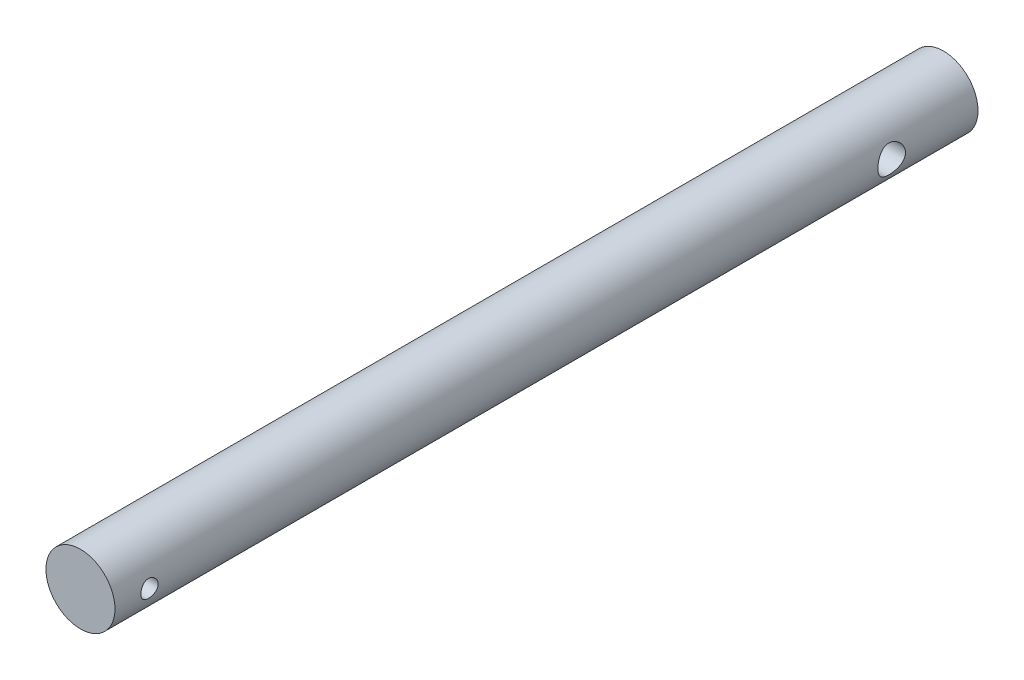
ISO-10303-21;
HEADER;
FILE_DESCRIPTION(('STEP AP214'),'2;1');
FILE_NAME('part.step','',(''),(''),'','','');
FILE_SCHEMA(('AUTOMOTIVE_DESIGN { 1 0 10303 214 1 1 1 1 }'));
ENDSEC;
DATA;
#1=APPLICATION_CONTEXT('core data for automotive mechanical design processes');
#2=APPLICATION_PROTOCOL_DEFINITION('international standard','automotive_design',2000,#1);
#3=PRODUCT_CONTEXT('',#1,'mechanical');
#4=PRODUCT('Part','Part','',(#3));
#5=PRODUCT_RELATED_PRODUCT_CATEGORY('part','',(#4));
#6=PRODUCT_DEFINITION_FORMATION('','',#4);
#7=PRODUCT_DEFINITION_CONTEXT('part definition',#1,'design');
#8=PRODUCT_DEFINITION('design','',#6,#7);
#9=PRODUCT_DEFINITION_SHAPE('','',#8);
#10=(LENGTH_UNIT() NAMED_UNIT(*) SI_UNIT(.MILLI.,.METRE.));
#11=(NAMED_UNIT(*) PLANE_ANGLE_UNIT() SI_UNIT($,.RADIAN.));
#12=(NAMED_UNIT(*) SI_UNIT($,.STERADIAN.) SOLID_ANGLE_UNIT());
#13=UNCERTAINTY_MEASURE_WITH_UNIT(LENGTH_MEASURE(1.E-05),#10,'distance_accuracy_value','');
#14=(GEOMETRIC_REPRESENTATION_CONTEXT(3) GLOBAL_UNCERTAINTY_ASSIGNED_CONTEXT((#13)) GLOBAL_UNIT_ASSIGNED_CONTEXT((#10,
#11,#12)) REPRESENTATION_CONTEXT('',''));
#15=CARTESIAN_POINT('',(0.,0.,0.));
#16=DIRECTION('',(0.,0.,1.));
#17=DIRECTION('',(1.,0.,0.));
#18=AXIS2_PLACEMENT_3D('',#15,#16,#17);
#19=CARTESIAN_POINT('',(0.,0.,250.));
#20=DIRECTION('',(0.,0.,-1.));
#21=DIRECTION('',(-1.,0.,0.));
#22=AXIS2_PLACEMENT_3D('',#19,#20,#21);
#23=CYLINDRICAL_SURFACE('',#22,10.);
#24=CARTESIAN_POINT('',(-10.,0.,237.5));
#25=CARTESIAN_POINT('',(-9.99999766446687,0.138126814449551,237.50000387623));
#26=CARTESIAN_POINT('',(-9.99710963553044,0.276296929717936,237.511485917956));
#27=CARTESIAN_POINT('',(-9.98586856383157,0.548677206284219,237.557041918845));
#28=CARTESIAN_POINT('',(-9.97751242366627,0.682885078117899,237.591128682563));
#29=CARTESIAN_POINT('',(-9.9562604388672,0.943368120304292,237.680732089104));
#30=CARTESIAN_POINT('',(-9.94337004736764,1.06965260571666,237.736222997859));
#31=CARTESIAN_POINT('',(-9.91442239679369,1.3111202198407,237.866968983408));
#32=CARTESIAN_POINT('',(-9.89836503090261,1.4263029739146,237.942224726865));
#33=CARTESIAN_POINT('',(-9.86445689319489,1.64466987883485,238.11200131609));
#34=CARTESIAN_POINT('',(-9.84657845246877,1.74759281676841,238.206852624932));
#35=CARTESIAN_POINT('',(-9.81122700196561,1.93624821200552,238.412420341515));
#36=CARTESIAN_POINT('',(-9.79375403816446,2.02197872824865,238.523138538245));
#37=CARTESIAN_POINT('',(-9.76091292830281,2.17504423799829,238.759325377895));
#38=CARTESIAN_POINT('',(-9.74557990774685,2.2420870265419,238.884988718015));
#39=CARTESIAN_POINT('',(-9.71915824696694,2.35399484758457,239.146247352767));
#40=CARTESIAN_POINT('',(-9.70806892824031,2.39886342573356,239.281841055553));
#41=CARTESIAN_POINT('',(-9.69167461160538,2.46425806134127,239.556239163669));
#42=CARTESIAN_POINT('',(-9.68625818328352,2.48525378055341,239.69492482673));
#43=CARTESIAN_POINT('',(-9.68148937432653,2.50376962511068,239.973947614999));
#44=CARTESIAN_POINT('',(-9.68213600713215,2.50129356969685,240.11428446782));
#45=CARTESIAN_POINT('',(-9.68932009194695,2.4733108743995,240.389026346242));
#46=CARTESIAN_POINT('',(-9.69571438345489,2.44836390031772,240.523492702442));
#47=CARTESIAN_POINT('',(-9.71344516118448,2.37704031150499,240.786268418185));
#48=CARTESIAN_POINT('',(-9.72478199948731,2.33066217011566,240.914577338382));
#49=CARTESIAN_POINT('',(-9.75125189842765,2.21731579656199,241.162896693754));
#50=CARTESIAN_POINT('',(-9.76642212449693,2.15014444538821,241.282810286316));
#51=CARTESIAN_POINT('',(-9.79882851409985,1.99726046002492,241.509864516261));
#52=CARTESIAN_POINT('',(-9.81606503891047,1.91154458134807,241.617002913445));
#53=CARTESIAN_POINT('',(-9.85126467566486,1.72110570780203,241.818672692824));
#54=CARTESIAN_POINT('',(-9.86923449130002,1.61591043027643,241.912757483436));
#55=CARTESIAN_POINT('',(-9.90343275964594,1.39101986250616,242.082035404107));
#56=CARTESIAN_POINT('',(-9.91966115915679,1.27132412951323,242.157227957106));
#57=CARTESIAN_POINT('',(-9.94862886823651,1.02019314780232,242.286750977041));
#58=CARTESIAN_POINT('',(-9.96135600212879,0.888718988681035,242.341008900424));
#59=CARTESIAN_POINT('',(-9.98179861652361,0.618126680238136,242.426528842849));
#60=CARTESIAN_POINT('',(-9.98951505565468,0.479009998584142,242.457795260697));
#61=CARTESIAN_POINT('',(-9.99892498785624,0.200899950650048,242.495762609265));
#62=CARTESIAN_POINT('',(-10.0007675584713,0.0619945333136862,242.503071710126));
#63=CARTESIAN_POINT('',(-9.99864674690754,-0.215054791335845,242.494584996574));
#64=CARTESIAN_POINT('',(-9.99468388736421,-0.353198766074324,242.478791262001));
#65=CARTESIAN_POINT('',(-9.98149301878918,-0.622690447960811,242.425048486014));
#66=CARTESIAN_POINT('',(-9.97234390309647,-0.754108531614574,242.387431227538));
#67=CARTESIAN_POINT('',(-9.94981177723595,-1.00876215408752,242.291488193286));
#68=CARTESIAN_POINT('',(-9.93642833949965,-1.13199686505441,242.233160326145));
#69=CARTESIAN_POINT('',(-9.9065551321037,-1.3692052240497,242.096273118542));
#70=CARTESIAN_POINT('',(-9.89001445611,-1.48297573639293,242.017373146006));
#71=CARTESIAN_POINT('',(-9.85574181979587,-1.69587768940551,241.842016818671));
#72=CARTESIAN_POINT('',(-9.83800965421578,-1.79500659828874,241.745557433971));
#73=CARTESIAN_POINT('',(-9.80281594932498,-1.97831761345414,241.534996731927));
#74=CARTESIAN_POINT('',(-9.78537173637464,-2.06207311270183,241.420520495001));
#75=CARTESIAN_POINT('',(-9.75321463970069,-2.20918459835603,241.178778942552));
#76=CARTESIAN_POINT('',(-9.73850163474941,-2.272541490269,241.051514195049));
#77=CARTESIAN_POINT('',(-9.71363491194665,-2.37658570101222,240.788490462656));
#78=CARTESIAN_POINT('',(-9.70345425375809,-2.4174073277393,240.652787286146));
#79=CARTESIAN_POINT('',(-9.68877906706586,-2.47557609990488,240.376150603575));
#80=CARTESIAN_POINT('',(-9.68428329504045,-2.49292837912651,240.235218248298));
#81=CARTESIAN_POINT('',(-9.68158168701612,-2.50339765056083,239.956464960231));
#82=CARTESIAN_POINT('',(-9.68319887888035,-2.49719649630131,239.818670941456));
#83=CARTESIAN_POINT('',(-9.69213181672143,-2.46229546385366,239.546160185556));
#84=CARTESIAN_POINT('',(-9.69944744817731,-2.43359603781098,239.411443386645));
#85=CARTESIAN_POINT('',(-9.71885434473222,-2.35488553240494,239.149652568224));
#86=CARTESIAN_POINT('',(-9.73091692061057,-2.30500234113402,239.022537824599));
#87=CARTESIAN_POINT('',(-9.7584625954084,-2.18544152267502,238.778391028811));
#88=CARTESIAN_POINT('',(-9.77394616867808,-2.11576115005695,238.661360378022));
#89=CARTESIAN_POINT('',(-9.80709390439337,-1.95644624772858,238.437408951663));
#90=CARTESIAN_POINT('',(-9.82480441386302,-1.86633860485377,238.330831544293));
#91=CARTESIAN_POINT('',(-9.86013378743769,-1.66964895198289,238.134088258674));
#92=CARTESIAN_POINT('',(-9.87775262878422,-1.56306303543525,238.043926283145));
#93=CARTESIAN_POINT('',(-9.91129426079449,-1.33411264450432,237.880981152392));
#94=CARTESIAN_POINT('',(-9.92718055609783,-1.21149737052732,237.808542310547));
#95=CARTESIAN_POINT('',(-9.95508208291861,-0.955443432517464,237.685420895099));
#96=CARTESIAN_POINT('',(-9.96710008666301,-0.822012605727902,237.634722732252));
#97=CARTESIAN_POINT('',(-9.98413432609236,-0.574017088739119,237.564046949451));
#98=CARTESIAN_POINT('',(-9.99004308421151,-0.460633618180113,237.540081261578));
#99=CARTESIAN_POINT('',(-9.9979767538658,-0.231510119227137,237.50805676063));
#100=CARTESIAN_POINT('',(-10.0000019575149,-0.115770268737693,237.499996751158));
#101=CARTESIAN_POINT('',(-10.,0.,237.5));
#102=B_SPLINE_CURVE_WITH_KNOTS('',3,(#24,#25,#26,#27,#28,#29,#30,#31,#32,#33,#34,#35,#36,#37,
#38,#39,#40,#41,#42,#43,#44,#45,#46,#47,#48,#49,#50,#51,#52,#53,#54,#55,#56,#57,#58,#59,#60,#61,
#62,#63,#64,#65,#66,#67,#68,#69,#70,#71,#72,#73,#74,#75,#76,#77,#78,#79,#80,#81,#82,#83,#84,#85,
#86,#87,#88,#89,#90,#91,#92,#93,#94,#95,#96,#97,#98,#99,#100,#101),.UNSPECIFIED.,.T.,.F.,(4,2,2,
2,2,2,2,2,2,2,2,2,2,2,2,2,2,2,2,2,2,2,2,2,2,2,2,2,2,2,2,2,2,2,2,2,2,2,4),(0.,0.413956187453145,
0.828147062939833,1.24184150381018,1.6555499002822,2.07690725728562,2.49831215966772,
2.92597745909678,3.35357435282279,3.77260491835114,4.19156730193362,4.60037495017229,
5.00921172448929,5.42217546461996,5.83521151399137,6.26002501620565,6.68485149269278,
7.11113715020724,7.53734122819938,7.95263848254327,8.36789835193438,8.77700457528928,
9.18615212209351,9.60255979281117,10.0190393835223,10.4457418201299,10.8724253125471,
11.2965375769763,11.7205570543047,12.1323963400748,12.5442273493652,12.9536066760887,
13.3630428023796,13.7831596069298,14.2033761629382,14.6312030917577,15.0587227304538,
15.4057040491338,15.7526592674819),.UNSPECIFIED.);
#103=CARTESIAN_POINT('',(-10.,0.,237.5));
#104=VERTEX_POINT('',#103);
#105=EDGE_CURVE('E10',#104,#104,#102,.T.);
#106=ORIENTED_EDGE('',*,*,#105,.T.);
#107=EDGE_LOOP('',(#106));
#108=FACE_BOUND('',#107,.T.);
#109=CARTESIAN_POINT('',(10.,0.,237.5));
#110=CARTESIAN_POINT('',(9.99999766446687,-0.138126814449551,237.50000387623));
#111=CARTESIAN_POINT('',(9.99710963553044,-0.276296929717936,237.511485917956));
#112=CARTESIAN_POINT('',(9.98586856383157,-0.548677206284219,237.557041918845));
#113=CARTESIAN_POINT('',(9.97751242366627,-0.682885078117899,237.591128682563));
#114=CARTESIAN_POINT('',(9.9562604388672,-0.943368120304292,237.680732089104));
#115=CARTESIAN_POINT('',(9.94337004736764,-1.06965260571666,237.736222997859));
#116=CARTESIAN_POINT('',(9.91442239679369,-1.3111202198407,237.866968983408));
#117=CARTESIAN_POINT('',(9.89836503090261,-1.4263029739146,237.942224726865));
#118=CARTESIAN_POINT('',(9.86445689319489,-1.64466987883485,238.11200131609));
#119=CARTESIAN_POINT('',(9.84657845246877,-1.74759281676841,238.206852624932));
#120=CARTESIAN_POINT('',(9.81122700196561,-1.93624821200552,238.412420341515));
#121=CARTESIAN_POINT('',(9.79375403816446,-2.02197872824865,238.523138538245));
#122=CARTESIAN_POINT('',(9.76091292830281,-2.17504423799829,238.759325377895));
#123=CARTESIAN_POINT('',(9.74557990774685,-2.2420870265419,238.884988718015));
#124=CARTESIAN_POINT('',(9.71915824696694,-2.35399484758457,239.146247352767));
#125=CARTESIAN_POINT('',(9.70806892824031,-2.39886342573356,239.281841055553));
#126=CARTESIAN_POINT('',(9.69167461160538,-2.46425806134127,239.556239163669));
#127=CARTESIAN_POINT('',(9.68625818328352,-2.48525378055341,239.69492482673));
#128=CARTESIAN_POINT('',(9.68148937432653,-2.50376962511068,239.973947614999));
#129=CARTESIAN_POINT('',(9.68213600713215,-2.50129356969685,240.11428446782));
#130=CARTESIAN_POINT('',(9.68932009194695,-2.4733108743995,240.389026346242));
#131=CARTESIAN_POINT('',(9.69571438345489,-2.44836390031772,240.523492702442));
#132=CARTESIAN_POINT('',(9.71344516118448,-2.37704031150499,240.786268418185));
#133=CARTESIAN_POINT('',(9.72478199948731,-2.33066217011566,240.914577338382));
#134=CARTESIAN_POINT('',(9.75125189842765,-2.21731579656199,241.162896693754));
#135=CARTESIAN_POINT('',(9.76642212449693,-2.15014444538821,241.282810286316));
#136=CARTESIAN_POINT('',(9.79882851409985,-1.99726046002492,241.509864516261));
#137=CARTESIAN_POINT('',(9.81606503891047,-1.91154458134807,241.617002913445));
#138=CARTESIAN_POINT('',(9.85126467566486,-1.72110570780203,241.818672692824));
#139=CARTESIAN_POINT('',(9.86923449130002,-1.61591043027643,241.912757483436));
#140=CARTESIAN_POINT('',(9.90343275964594,-1.39101986250616,242.082035404107));
#141=CARTESIAN_POINT('',(9.91966115915679,-1.27132412951323,242.157227957106));
#142=CARTESIAN_POINT('',(9.94862886823651,-1.02019314780232,242.286750977041));
#143=CARTESIAN_POINT('',(9.96135600212879,-0.888718988681035,242.341008900424));
#144=CARTESIAN_POINT('',(9.98179861652361,-0.618126680238136,242.426528842849));
#145=CARTESIAN_POINT('',(9.98951505565468,-0.479009998584142,242.457795260697));
#146=CARTESIAN_POINT('',(9.99892498785624,-0.200899950650048,242.495762609265));
#147=CARTESIAN_POINT('',(10.0007675584713,-0.0619945333136862,242.503071710126));
#148=CARTESIAN_POINT('',(9.99864674690754,0.215054791335845,242.494584996574));
#149=CARTESIAN_POINT('',(9.99468388736421,0.353198766074324,242.478791262001));
#150=CARTESIAN_POINT('',(9.98149301878918,0.622690447960811,242.425048486014));
#151=CARTESIAN_POINT('',(9.97234390309647,0.754108531614574,242.387431227538));
#152=CARTESIAN_POINT('',(9.94981177723595,1.00876215408752,242.291488193286));
#153=CARTESIAN_POINT('',(9.93642833949965,1.13199686505441,242.233160326145));
#154=CARTESIAN_POINT('',(9.9065551321037,1.3692052240497,242.096273118542));
#155=CARTESIAN_POINT('',(9.89001445611,1.48297573639293,242.017373146006));
#156=CARTESIAN_POINT('',(9.85574181979587,1.69587768940551,241.842016818671));
#157=CARTESIAN_POINT('',(9.83800965421578,1.79500659828874,241.745557433971));
#158=CARTESIAN_POINT('',(9.80281594932498,1.97831761345414,241.534996731927));
#159=CARTESIAN_POINT('',(9.78537173637464,2.06207311270183,241.420520495001));
#160=CARTESIAN_POINT('',(9.75321463970069,2.20918459835603,241.178778942552));
#161=CARTESIAN_POINT('',(9.73850163474941,2.272541490269,241.051514195049));
#162=CARTESIAN_POINT('',(9.71363491194665,2.37658570101222,240.788490462656));
#163=CARTESIAN_POINT('',(9.70345425375809,2.4174073277393,240.652787286146));
#164=CARTESIAN_POINT('',(9.68877906706586,2.47557609990488,240.376150603575));
#165=CARTESIAN_POINT('',(9.68428329504045,2.49292837912651,240.235218248298));
#166=CARTESIAN_POINT('',(9.68158168701612,2.50339765056083,239.956464960231));
#167=CARTESIAN_POINT('',(9.68319887888035,2.49719649630131,239.818670941456));
#168=CARTESIAN_POINT('',(9.69213181672143,2.46229546385366,239.546160185556));
#169=CARTESIAN_POINT('',(9.69944744817731,2.43359603781098,239.411443386645));
#170=CARTESIAN_POINT('',(9.71885434473222,2.35488553240494,239.149652568224));
#171=CARTESIAN_POINT('',(9.73091692061057,2.30500234113402,239.022537824599));
#172=CARTESIAN_POINT('',(9.7584625954084,2.18544152267502,238.778391028811));
#173=CARTESIAN_POINT('',(9.77394616867808,2.11576115005695,238.661360378022));
#174=CARTESIAN_POINT('',(9.80709390439337,1.95644624772858,238.437408951663));
#175=CARTESIAN_POINT('',(9.82480441386302,1.86633860485377,238.330831544293));
#176=CARTESIAN_POINT('',(9.86013378743769,1.66964895198289,238.134088258674));
#177=CARTESIAN_POINT('',(9.87775262878422,1.56306303543525,238.043926283145));
#178=CARTESIAN_POINT('',(9.91129426079449,1.33411264450432,237.880981152392));
#179=CARTESIAN_POINT('',(9.92718055609783,1.21149737052732,237.808542310547));
#180=CARTESIAN_POINT('',(9.95508208291861,0.955443432517464,237.685420895099));
#181=CARTESIAN_POINT('',(9.96710008666301,0.822012605727902,237.634722732252));
#182=CARTESIAN_POINT('',(9.98413432609236,0.574017088739119,237.564046949451));
#183=CARTESIAN_POINT('',(9.99004308421151,0.460633618180113,237.540081261578));
#184=CARTESIAN_POINT('',(9.9979767538658,0.231510119227137,237.50805676063));
#185=CARTESIAN_POINT('',(10.0000019575149,0.115770268737693,237.499996751158));
#186=CARTESIAN_POINT('',(10.,0.,237.5));
#187=B_SPLINE_CURVE_WITH_KNOTS('',3,(#109,#110,#111,#112,#113,#114,#115,#116,#117,#118,#119,
#120,#121,#122,#123,#124,#125,#126,#127,#128,#129,#130,#131,#132,#133,#134,#135,#136,#137,#138,
#139,#140,#141,#142,#143,#144,#145,#146,#147,#148,#149,#150,#151,#152,#153,#154,#155,#156,#157,
#158,#159,#160,#161,#162,#163,#164,#165,#166,#167,#168,#169,#170,#171,#172,#173,#174,#175,#176,
#177,#178,#179,#180,#181,#182,#183,#184,#185,#186),.UNSPECIFIED.,.T.,.F.,(4,2,2,2,2,2,2,2,2,2,2,
2,2,2,2,2,2,2,2,2,2,2,2,2,2,2,2,2,2,2,2,2,2,2,2,2,2,2,4),(0.,0.413956187453145,
0.828147062939833,1.24184150381018,1.6555499002822,2.07690725728562,2.49831215966772,
2.92597745909678,3.35357435282279,3.77260491835114,4.19156730193362,4.60037495017229,
5.00921172448929,5.42217546461996,5.83521151399137,6.26002501620565,6.68485149269278,
7.11113715020724,7.53734122819938,7.95263848254327,8.36789835193438,8.77700457528928,
9.18615212209351,9.60255979281117,10.0190393835223,10.4457418201299,10.8724253125471,
11.2965375769763,11.7205570543047,12.1323963400748,12.5442273493652,12.9536066760887,
13.3630428023796,13.7831596069298,14.2033761629382,14.6312030917577,15.0587227304538,
15.4057040491338,15.7526592674819),.UNSPECIFIED.);
#188=CARTESIAN_POINT('',(10.,0.,237.5));
#189=VERTEX_POINT('',#188);
#190=EDGE_CURVE('E42',#189,#189,#187,.T.);
#191=ORIENTED_EDGE('',*,*,#190,.T.);
#192=EDGE_LOOP('',(#191));
#193=FACE_BOUND('',#192,.T.);
#194=CARTESIAN_POINT('',(-10.,0.,21.));
#195=CARTESIAN_POINT('',(-9.99999886871264,0.107549581345536,21.0000015749329));
#196=CARTESIAN_POINT('',(-9.99825999367799,0.21513214794036,21.0043436710802));
#197=CARTESIAN_POINT('',(-9.99134740691108,0.429535200549547,21.0216733827839));
#198=CARTESIAN_POINT('',(-9.98617152790588,0.5363551627033,21.0346664534026));
#199=CARTESIAN_POINT('',(-9.97250573560117,0.748635856497415,21.0692080345506));
#200=CARTESIAN_POINT('',(-9.96400865312144,0.854093134440868,21.0907750546198));
#201=CARTESIAN_POINT('',(-9.94393017211574,1.06266761114009,21.1422417304368));
#202=CARTESIAN_POINT('',(-9.932347522545,1.16578384227259,21.1721447662553));
#203=CARTESIAN_POINT('',(-9.89349112162205,1.46979509681069,21.273722808716));
#204=CARTESIAN_POINT('',(-9.86204458846134,1.66629107461992,21.3574218190064));
#205=CARTESIAN_POINT('',(-9.79113035538708,2.04217417878101,21.5540462173498));
#206=CARTESIAN_POINT('',(-9.75166544086262,2.22156721456798,21.6669614601149));
#207=CARTESIAN_POINT('',(-9.66661825353092,2.56699339938209,21.9244687545217));
#208=CARTESIAN_POINT('',(-9.62084608086599,2.73212223266508,22.0702127105756));
#209=CARTESIAN_POINT('',(-9.52921139577231,3.03635232313263,22.386800609152));
#210=CARTESIAN_POINT('',(-9.48334885017047,3.17544084661153,22.5576567590165));
#211=CARTESIAN_POINT('',(-9.39445587657958,3.42974847409894,22.9288559685663));
#212=CARTESIAN_POINT('',(-9.35164233015934,3.54362978572887,23.1301729260637));
#213=CARTESIAN_POINT('',(-9.2766729328807,3.73550961465234,23.5510728428009));
#214=CARTESIAN_POINT('',(-9.24451202207146,3.81352517485723,23.7706470677414));
#215=CARTESIAN_POINT('',(-9.19652715590089,3.92779760260541,24.2114246556858));
#216=CARTESIAN_POINT('',(-9.18002840771385,3.96578791979826,24.4321024680881));
#217=CARTESIAN_POINT('',(-9.16328008038143,4.00434593508728,24.8772699996773));
#218=CARTESIAN_POINT('',(-9.16302251073203,4.00493203570086,25.1017577900111));
#219=CARTESIAN_POINT('',(-9.17821000534301,3.9699787321474,25.5315133422232));
#220=CARTESIAN_POINT('',(-9.19256349925666,3.93695062778272,25.7370314287657));
#221=CARTESIAN_POINT('',(-9.23352375055553,3.83989376129508,26.1393191123503));
#222=CARTESIAN_POINT('',(-9.26013264599921,3.77585958980135,26.3360871763063));
#223=CARTESIAN_POINT('',(-9.32318970221162,3.6173894649114,26.7200356722919));
#224=CARTESIAN_POINT('',(-9.35982758573424,3.52235972457939,26.9069384780825));
#225=CARTESIAN_POINT('',(-9.43876232767927,3.30501292151569,27.26283163275));
#226=CARTESIAN_POINT('',(-9.48106130910412,3.18268561021589,27.4318152188131));
#227=CARTESIAN_POINT('',(-9.57053473488081,2.90310119889356,27.760819457596));
#228=CARTESIAN_POINT('',(-9.61783329953252,2.74387492593716,27.9191374588899));
#229=CARTESIAN_POINT('',(-9.70919649915615,2.40062885486449,28.2073689560062));
#230=CARTESIAN_POINT('',(-9.75326048890393,2.21660413066997,28.3372767948212));
#231=CARTESIAN_POINT('',(-9.83429362529359,1.82415530521055,28.5672348948311));
#232=CARTESIAN_POINT('',(-9.87110540190899,1.61532098269266,28.6666445623939));
#233=CARTESIAN_POINT('',(-9.93229656657448,1.18204753096606,28.8283357221563));
#234=CARTESIAN_POINT('',(-9.95668226924746,0.957616393699399,28.8906360751149));
#235=CARTESIAN_POINT('',(-9.98912279013839,0.513791775215591,28.9728965908394));
#236=CARTESIAN_POINT('',(-9.99805891667034,0.29488658797114,28.9951449085071));
#237=CARTESIAN_POINT('',(-10.0013695702126,-0.143690619615707,29.0034262010573));
#238=CARTESIAN_POINT('',(-9.99574787164577,-0.363362426448184,28.9894685630952));
#239=CARTESIAN_POINT('',(-9.97115134127512,-0.786865478243655,28.9274164948959));
#240=CARTESIAN_POINT('',(-9.95278782691064,-0.990964983549762,28.8808840392975));
#241=CARTESIAN_POINT('',(-9.90518882810983,-1.38827085612275,28.757128583381));
#242=CARTESIAN_POINT('',(-9.87595194712999,-1.58147582045412,28.6799016406648));
#243=CARTESIAN_POINT('',(-9.80833189541687,-1.95815757162884,28.4944301206379));
#244=CARTESIAN_POINT('',(-9.76969631959847,-2.14115604549353,28.3853090559053));
#245=CARTESIAN_POINT('',(-9.68746729490809,-2.4868871825104,28.1401193521971));
#246=CARTESIAN_POINT('',(-9.64387186219643,-2.64961168158684,28.0040399141861));
#247=CARTESIAN_POINT('',(-9.55290235277181,-2.96144608598878,27.6982599740674));
#248=CARTESIAN_POINT('',(-9.50546882853787,-3.10894786734725,27.5269329168592));
#249=CARTESIAN_POINT('',(-9.41483345830581,-3.37350239509234,27.1611198341097));
#250=CARTESIAN_POINT('',(-9.37163231039242,-3.4905501236659,26.9666299998006));
#251=CARTESIAN_POINT('',(-9.2942859982933,-3.69161500286277,26.5570766103267));
#252=CARTESIAN_POINT('',(-9.26023261821741,-3.77530118531766,26.3418319997565));
#253=CARTESIAN_POINT('',(-9.20647346903737,-3.90459244315908,25.8985326983872));
#254=CARTESIAN_POINT('',(-9.18675711197461,-3.95022562452798,25.6704875951582));
#255=CARTESIAN_POINT('',(-9.16543518780389,-3.99943122157416,25.225744190156));
#256=CARTESIAN_POINT('',(-9.16262842667612,-4.00579411777209,25.009410298105));
#257=CARTESIAN_POINT('',(-9.17229671415009,-3.98360636538274,24.5789103072789));
#258=CARTESIAN_POINT('',(-9.18476982225497,-3.9550601501471,24.3647439367175));
#259=CARTESIAN_POINT('',(-9.2225330048627,-3.86614256488129,23.9533355391097));
#260=CARTESIAN_POINT('',(-9.2472967218297,-3.80707437387706,23.7557591537789));
#261=CARTESIAN_POINT('',(-9.30647993934966,-3.66001151041637,23.3732430382103));
#262=CARTESIAN_POINT('',(-9.34090210615105,-3.5720088493455,23.1883068148887));
#263=CARTESIAN_POINT('',(-9.41797252826471,-3.36374310804133,22.8247795892905));
#264=CARTESIAN_POINT('',(-9.46097893410836,-3.24192140926543,22.6471581693117));
#265=CARTESIAN_POINT('',(-9.54927479921251,-2.97179350239177,22.3140178573752));
#266=CARTESIAN_POINT('',(-9.59456494363941,-2.82347931168581,22.15850565271));
#267=CARTESIAN_POINT('',(-9.68587647140965,-2.49297412446699,21.8635764074694));
#268=CARTESIAN_POINT('',(-9.73175488236393,-2.30921017071955,21.7258566160177));
#269=CARTESIAN_POINT('',(-9.7949502762577,-2.01716584575533,21.5439518910625));
#270=CARTESIAN_POINT('',(-9.81509269692655,-1.91699501972424,21.487392936147));
#271=CARTESIAN_POINT('',(-9.85294835133019,-1.7118011098248,21.3829620045947));
#272=CARTESIAN_POINT('',(-9.87066269647665,-1.60678027559742,21.335086050192));
#273=CARTESIAN_POINT('',(-9.9028559935491,-1.39454646904328,21.249252015315));
#274=CARTESIAN_POINT('',(-9.91738778532477,-1.28740777135871,21.2111298452528));
#275=CARTESIAN_POINT('',(-9.94319722915714,-1.06995577523383,21.1440786522787));
#276=CARTESIAN_POINT('',(-9.95447639837582,-0.959643983352619,21.1151453426501));
#277=CARTESIAN_POINT('',(-9.97343330649399,-0.736945215856838,21.066825163851));
#278=CARTESIAN_POINT('',(-9.98112017494336,-0.624564263591283,21.047414088355));
#279=CARTESIAN_POINT('',(-9.99270031578293,-0.398419132407604,21.0182614293338));
#280=CARTESIAN_POINT('',(-9.99659628445551,-0.284655994966353,21.0085129731657));
#281=CARTESIAN_POINT('',(-9.99951445883957,-0.113830463425492,21.0012141044266));
#282=CARTESIAN_POINT('',(-10.0000005987258,-0.0569198512645297,20.999999166478));
#283=CARTESIAN_POINT('',(-10.,0.,21.));
#284=B_SPLINE_CURVE_WITH_KNOTS('',3,(#194,#195,#196,#197,#198,#199,#200,#201,#202,#203,#204,
#205,#206,#207,#208,#209,#210,#211,#212,#213,#214,#215,#216,#217,#218,#219,#220,#221,#222,#223,
#224,#225,#226,#227,#228,#229,#230,#231,#232,#233,#234,#235,#236,#237,#238,#239,#240,#241,#242,
#243,#244,#245,#246,#247,#248,#249,#250,#251,#252,#253,#254,#255,#256,#257,#258,#259,#260,#261,
#262,#263,#264,#265,#266,#267,#268,#269,#270,#271,#272,#273,#274,#275,#276,#277,#278,#279,#280,
#281,#282,#283),.UNSPECIFIED.,.T.,.F.,(4,2,2,2,2,2,2,2,2,2,2,2,2,2,2,2,2,2,2,2,2,2,2,2,2,2,2,2,
2,2,2,2,2,2,2,2,2,2,2,2,2,2,2,2,4),(0.,0.322603993422154,0.645411604786481,0.968919914471234,
1.29255959093094,1.93701523385824,2.58124739027476,3.25313995292302,3.9253602176033,
4.62749749529941,5.32930078128044,5.99927442509165,6.66891844572483,7.29195888698823,
7.9151080641227,8.55097484497807,9.18708075776542,9.87235930273289,10.5577741757964,
11.2567305822579,11.9553314412776,12.6125760095619,13.2696501904034,13.8972014302891,
14.5248332988777,15.171662586967,15.8187515089811,16.50856181149,17.1984856998767,
17.8950932218183,18.5911857719204,19.2371857868567,19.8831037702627,20.5034786899771,
21.124025035105,21.7801016801356,22.4363763459696,23.1352007896785,23.4851924266232,
23.8350233218042,24.1785111324565,24.52183846562,24.8642884495951,25.2064946871486,
25.3772305569976),.UNSPECIFIED.);
#285=CARTESIAN_POINT('',(-10.,0.,21.));
#286=VERTEX_POINT('',#285);
#287=EDGE_CURVE('E46',#286,#286,#284,.T.);
#288=ORIENTED_EDGE('',*,*,#287,.T.);
#289=EDGE_LOOP('',(#288));
#290=FACE_BOUND('',#289,.T.);
#291=CARTESIAN_POINT('',(10.,0.,21.));
#292=CARTESIAN_POINT('',(9.99999886871264,-0.107549581345536,21.0000015749329));
#293=CARTESIAN_POINT('',(9.99825999367799,-0.21513214794036,21.0043436710802));
#294=CARTESIAN_POINT('',(9.99134740691108,-0.429535200549547,21.0216733827839));
#295=CARTESIAN_POINT('',(9.98617152790588,-0.5363551627033,21.0346664534026));
#296=CARTESIAN_POINT('',(9.97250573560117,-0.748635856497415,21.0692080345506));
#297=CARTESIAN_POINT('',(9.96400865312144,-0.854093134440868,21.0907750546198));
#298=CARTESIAN_POINT('',(9.94393017211574,-1.06266761114009,21.1422417304368));
#299=CARTESIAN_POINT('',(9.932347522545,-1.16578384227259,21.1721447662553));
#300=CARTESIAN_POINT('',(9.89349112162205,-1.46979509681069,21.273722808716));
#301=CARTESIAN_POINT('',(9.86204458846134,-1.66629107461992,21.3574218190064));
#302=CARTESIAN_POINT('',(9.79113035538708,-2.04217417878101,21.5540462173498));
#303=CARTESIAN_POINT('',(9.75166544086262,-2.22156721456798,21.6669614601149));
#304=CARTESIAN_POINT('',(9.66661825353092,-2.56699339938209,21.9244687545217));
#305=CARTESIAN_POINT('',(9.62084608086599,-2.73212223266508,22.0702127105756));
#306=CARTESIAN_POINT('',(9.52921139577231,-3.03635232313263,22.386800609152));
#307=CARTESIAN_POINT('',(9.48334885017047,-3.17544084661153,22.5576567590165));
#308=CARTESIAN_POINT('',(9.39445587657958,-3.42974847409894,22.9288559685663));
#309=CARTESIAN_POINT('',(9.35164233015934,-3.54362978572887,23.1301729260637));
#310=CARTESIAN_POINT('',(9.2766729328807,-3.73550961465234,23.5510728428009));
#311=CARTESIAN_POINT('',(9.24451202207146,-3.81352517485723,23.7706470677414));
#312=CARTESIAN_POINT('',(9.19652715590089,-3.92779760260541,24.2114246556858));
#313=CARTESIAN_POINT('',(9.18002840771385,-3.96578791979826,24.4321024680881));
#314=CARTESIAN_POINT('',(9.16328008038143,-4.00434593508728,24.8772699996773));
#315=CARTESIAN_POINT('',(9.16302251073203,-4.00493203570086,25.1017577900111));
#316=CARTESIAN_POINT('',(9.17821000534301,-3.9699787321474,25.5315133422232));
#317=CARTESIAN_POINT('',(9.19256349925666,-3.93695062778272,25.7370314287657));
#318=CARTESIAN_POINT('',(9.23352375055553,-3.83989376129508,26.1393191123503));
#319=CARTESIAN_POINT('',(9.26013264599921,-3.77585958980135,26.3360871763063));
#320=CARTESIAN_POINT('',(9.32318970221162,-3.6173894649114,26.7200356722919));
#321=CARTESIAN_POINT('',(9.35982758573424,-3.52235972457939,26.9069384780825));
#322=CARTESIAN_POINT('',(9.43876232767927,-3.30501292151569,27.26283163275));
#323=CARTESIAN_POINT('',(9.48106130910412,-3.18268561021589,27.4318152188131));
#324=CARTESIAN_POINT('',(9.57053473488081,-2.90310119889356,27.760819457596));
#325=CARTESIAN_POINT('',(9.61783329953252,-2.74387492593716,27.9191374588899));
#326=CARTESIAN_POINT('',(9.70919649915615,-2.40062885486449,28.2073689560062));
#327=CARTESIAN_POINT('',(9.75326048890393,-2.21660413066997,28.3372767948212));
#328=CARTESIAN_POINT('',(9.83429362529359,-1.82415530521055,28.5672348948311));
#329=CARTESIAN_POINT('',(9.87110540190899,-1.61532098269266,28.6666445623939));
#330=CARTESIAN_POINT('',(9.93229656657448,-1.18204753096606,28.8283357221563));
#331=CARTESIAN_POINT('',(9.95668226924746,-0.957616393699399,28.8906360751149));
#332=CARTESIAN_POINT('',(9.98912279013839,-0.513791775215591,28.9728965908394));
#333=CARTESIAN_POINT('',(9.99805891667034,-0.29488658797114,28.9951449085071));
#334=CARTESIAN_POINT('',(10.0013695702126,0.143690619615707,29.0034262010573));
#335=CARTESIAN_POINT('',(9.99574787164577,0.363362426448184,28.9894685630952));
#336=CARTESIAN_POINT('',(9.97115134127512,0.786865478243655,28.9274164948959));
#337=CARTESIAN_POINT('',(9.95278782691064,0.990964983549762,28.8808840392975));
#338=CARTESIAN_POINT('',(9.90518882810983,1.38827085612275,28.757128583381));
#339=CARTESIAN_POINT('',(9.87595194712999,1.58147582045412,28.6799016406648));
#340=CARTESIAN_POINT('',(9.80833189541687,1.95815757162884,28.4944301206379));
#341=CARTESIAN_POINT('',(9.76969631959847,2.14115604549353,28.3853090559053));
#342=CARTESIAN_POINT('',(9.68746729490809,2.4868871825104,28.1401193521971));
#343=CARTESIAN_POINT('',(9.64387186219643,2.64961168158684,28.0040399141861));
#344=CARTESIAN_POINT('',(9.55290235277181,2.96144608598878,27.6982599740674));
#345=CARTESIAN_POINT('',(9.50546882853787,3.10894786734725,27.5269329168592));
#346=CARTESIAN_POINT('',(9.41483345830581,3.37350239509234,27.1611198341097));
#347=CARTESIAN_POINT('',(9.37163231039242,3.4905501236659,26.9666299998006));
#348=CARTESIAN_POINT('',(9.2942859982933,3.69161500286277,26.5570766103267));
#349=CARTESIAN_POINT('',(9.26023261821741,3.77530118531766,26.3418319997565));
#350=CARTESIAN_POINT('',(9.20647346903737,3.90459244315908,25.8985326983872));
#351=CARTESIAN_POINT('',(9.18675711197461,3.95022562452798,25.6704875951582));
#352=CARTESIAN_POINT('',(9.16543518780389,3.99943122157416,25.225744190156));
#353=CARTESIAN_POINT('',(9.16262842667612,4.00579411777209,25.009410298105));
#354=CARTESIAN_POINT('',(9.17229671415009,3.98360636538274,24.5789103072789));
#355=CARTESIAN_POINT('',(9.18476982225497,3.9550601501471,24.3647439367175));
#356=CARTESIAN_POINT('',(9.2225330048627,3.86614256488129,23.9533355391097));
#357=CARTESIAN_POINT('',(9.2472967218297,3.80707437387706,23.7557591537789));
#358=CARTESIAN_POINT('',(9.30647993934966,3.66001151041637,23.3732430382103));
#359=CARTESIAN_POINT('',(9.34090210615105,3.5720088493455,23.1883068148887));
#360=CARTESIAN_POINT('',(9.41797252826471,3.36374310804133,22.8247795892905));
#361=CARTESIAN_POINT('',(9.46097893410836,3.24192140926543,22.6471581693117));
#362=CARTESIAN_POINT('',(9.54927479921251,2.97179350239177,22.3140178573752));
#363=CARTESIAN_POINT('',(9.59456494363941,2.82347931168581,22.15850565271));
#364=CARTESIAN_POINT('',(9.68587647140965,2.49297412446699,21.8635764074694));
#365=CARTESIAN_POINT('',(9.73175488236393,2.30921017071955,21.7258566160177));
#366=CARTESIAN_POINT('',(9.7949502762577,2.01716584575533,21.5439518910625));
#367=CARTESIAN_POINT('',(9.81509269692655,1.91699501972424,21.487392936147));
#368=CARTESIAN_POINT('',(9.85294835133019,1.7118011098248,21.3829620045947));
#369=CARTESIAN_POINT('',(9.87066269647665,1.60678027559742,21.335086050192));
#370=CARTESIAN_POINT('',(9.9028559935491,1.39454646904328,21.249252015315));
#371=CARTESIAN_POINT('',(9.91738778532477,1.28740777135871,21.2111298452528));
#372=CARTESIAN_POINT('',(9.94319722915714,1.06995577523383,21.1440786522787));
#373=CARTESIAN_POINT('',(9.95447639837582,0.959643983352619,21.1151453426501));
#374=CARTESIAN_POINT('',(9.97343330649399,0.736945215856838,21.066825163851));
#375=CARTESIAN_POINT('',(9.98112017494336,0.624564263591283,21.047414088355));
#376=CARTESIAN_POINT('',(9.99270031578293,0.398419132407604,21.0182614293338));
#377=CARTESIAN_POINT('',(9.99659628445551,0.284655994966353,21.0085129731657));
#378=CARTESIAN_POINT('',(9.99951445883957,0.113830463425492,21.0012141044266));
#379=CARTESIAN_POINT('',(10.0000005987258,0.0569198512645297,20.999999166478));
#380=CARTESIAN_POINT('',(10.,0.,21.));
#381=B_SPLINE_CURVE_WITH_KNOTS('',3,(#291,#292,#293,#294,#295,#296,#297,#298,#299,#300,#301,
#302,#303,#304,#305,#306,#307,#308,#309,#310,#311,#312,#313,#314,#315,#316,#317,#318,#319,#320,
#321,#322,#323,#324,#325,#326,#327,#328,#329,#330,#331,#332,#333,#334,#335,#336,#337,#338,#339,
#340,#341,#342,#343,#344,#345,#346,#347,#348,#349,#350,#351,#352,#353,#354,#355,#356,#357,#358,
#359,#360,#361,#362,#363,#364,#365,#366,#367,#368,#369,#370,#371,#372,#373,#374,#375,#376,#377,
#378,#379,#380),.UNSPECIFIED.,.T.,.F.,(4,2,2,2,2,2,2,2,2,2,2,2,2,2,2,2,2,2,2,2,2,2,2,2,2,2,2,2,
2,2,2,2,2,2,2,2,2,2,2,2,2,2,2,2,4),(0.,0.322603993422154,0.645411604786481,0.968919914471234,
1.29255959093094,1.93701523385824,2.58124739027476,3.25313995292302,3.9253602176033,
4.62749749529941,5.32930078128044,5.99927442509165,6.66891844572483,7.29195888698823,
7.9151080641227,8.55097484497807,9.18708075776542,9.87235930273289,10.5577741757964,
11.2567305822579,11.9553314412776,12.6125760095619,13.2696501904034,13.8972014302891,
14.5248332988777,15.171662586967,15.8187515089811,16.50856181149,17.1984856998767,
17.8950932218183,18.5911857719204,19.2371857868567,19.8831037702627,20.5034786899771,
21.124025035105,21.7801016801356,22.4363763459696,23.1352007896785,23.4851924266232,
23.8350233218042,24.1785111324565,24.52183846562,24.8642884495951,25.2064946871486,
25.3772305569976),.UNSPECIFIED.);
#382=CARTESIAN_POINT('',(10.,0.,21.));
#383=VERTEX_POINT('',#382);
#384=EDGE_CURVE('E50',#383,#383,#381,.T.);
#385=ORIENTED_EDGE('',*,*,#384,.T.);
#386=EDGE_LOOP('',(#385));
#387=FACE_BOUND('',#386,.T.);
#388=CARTESIAN_POINT('',(0.,0.,250.));
#389=DIRECTION('',(0.,0.,1.));
#390=DIRECTION('',(1.,0.,0.));
#391=AXIS2_PLACEMENT_3D('',#388,#389,#390);
#392=CIRCLE('',#391,10.);
#393=CARTESIAN_POINT('',(10.,0.,250.));
#394=VERTEX_POINT('',#393);
#395=EDGE_CURVE('E78',#394,#394,#392,.T.);
#396=ORIENTED_EDGE('',*,*,#395,.F.);
#397=EDGE_LOOP('',(#396));
#398=FACE_BOUND('',#397,.T.);
#399=CARTESIAN_POINT('',(0.,0.,0.));
#400=DIRECTION('',(0.,0.,1.));
#401=DIRECTION('',(1.,0.,0.));
#402=AXIS2_PLACEMENT_3D('',#399,#400,#401);
#403=CIRCLE('',#402,10.);
#404=CARTESIAN_POINT('',(10.,0.,0.));
#405=VERTEX_POINT('',#404);
#406=EDGE_CURVE('E79',#405,#405,#403,.T.);
#407=ORIENTED_EDGE('',*,*,#406,.T.);
#408=EDGE_LOOP('',(#407));
#409=FACE_BOUND('',#408,.T.);
#410=ADVANCED_FACE('F31',(#108,#193,#290,#387,#398,#409),#23,.T.);
#411=CARTESIAN_POINT('',(0.,0.,250.));
#412=DIRECTION('',(0.,0.,1.));
#413=DIRECTION('',(1.,0.,0.));
#414=AXIS2_PLACEMENT_3D('',#411,#412,#413);
#415=PLANE('',#414);
#416=ORIENTED_EDGE('',*,*,#395,.T.);
#417=EDGE_LOOP('',(#416));
#418=FACE_BOUND('',#417,.T.);
#419=ADVANCED_FACE('F71',(#418),#415,.T.);
#420=CARTESIAN_POINT('',(0.,0.,0.));
#421=DIRECTION('',(0.,0.,1.));
#422=DIRECTION('',(1.,0.,0.));
#423=AXIS2_PLACEMENT_3D('',#420,#421,#422);
#424=PLANE('',#423);
#425=ORIENTED_EDGE('',*,*,#406,.F.);
#426=EDGE_LOOP('',(#425));
#427=FACE_BOUND('',#426,.T.);
#428=ADVANCED_FACE('F69',(#427),#424,.F.);
#429=CARTESIAN_POINT('',(-10.,0.,25.));
#430=DIRECTION('',(1.,0.,0.));
#431=DIRECTION('',(0.,0.,-1.));
#432=AXIS2_PLACEMENT_3D('',#429,#430,#431);
#433=CYLINDRICAL_SURFACE('',#432,4.);
#434=ORIENTED_EDGE('',*,*,#384,.F.);
#435=EDGE_LOOP('',(#434));
#436=FACE_BOUND('',#435,.T.);
#437=ORIENTED_EDGE('',*,*,#287,.F.);
#438=EDGE_LOOP('',(#437));
#439=FACE_BOUND('',#438,.T.);
#440=ADVANCED_FACE('F63',(#436,#439),#433,.F.);
#441=CARTESIAN_POINT('',(-10.,0.,240.));
#442=DIRECTION('',(1.,0.,0.));
#443=DIRECTION('',(0.,0.,-1.));
#444=AXIS2_PLACEMENT_3D('',#441,#442,#443);
#445=CYLINDRICAL_SURFACE('',#444,2.5);
#446=ORIENTED_EDGE('',*,*,#190,.F.);
#447=EDGE_LOOP('',(#446));
#448=FACE_BOUND('',#447,.T.);
#449=ORIENTED_EDGE('',*,*,#105,.F.);
#450=EDGE_LOOP('',(#449));
#451=FACE_BOUND('',#450,.T.);
#452=ADVANCED_FACE('F60',(#448,#451),#445,.F.);
#453=CLOSED_SHELL('',(#410,#419,#428,#440,#452));
#454=MANIFOLD_SOLID_BREP('B2',#453);
#455=ADVANCED_BREP_SHAPE_REPRESENTATION('',(#18,#454),#14);
#456=SHAPE_DEFINITION_REPRESENTATION(#9,#455);
ENDSEC;
END-ISO-10303-21;
